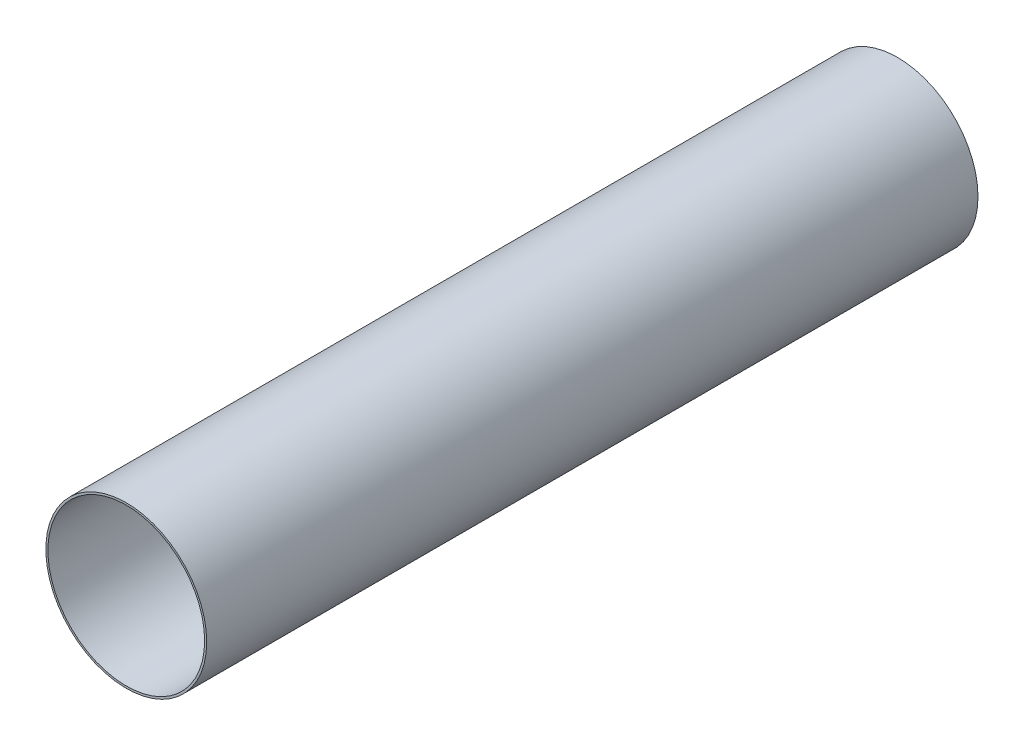
ISO-10303-21;
HEADER;
FILE_DESCRIPTION(('STEP AP214'),'2;1');
FILE_NAME('part.step','',(''),(''),'','','');
FILE_SCHEMA(('AUTOMOTIVE_DESIGN { 1 0 10303 214 1 1 1 1 }'));
ENDSEC;
DATA;
#1=APPLICATION_CONTEXT('core data for automotive mechanical design processes');
#2=APPLICATION_PROTOCOL_DEFINITION('international standard','automotive_design',2000,#1);
#3=PRODUCT_CONTEXT('',#1,'mechanical');
#4=PRODUCT('Part','Part','',(#3));
#5=PRODUCT_RELATED_PRODUCT_CATEGORY('part','',(#4));
#6=PRODUCT_DEFINITION_FORMATION('','',#4);
#7=PRODUCT_DEFINITION_CONTEXT('part definition',#1,'design');
#8=PRODUCT_DEFINITION('design','',#6,#7);
#9=PRODUCT_DEFINITION_SHAPE('','',#8);
#10=(LENGTH_UNIT() NAMED_UNIT(*) SI_UNIT(.MILLI.,.METRE.));
#11=(NAMED_UNIT(*) PLANE_ANGLE_UNIT() SI_UNIT($,.RADIAN.));
#12=(NAMED_UNIT(*) SI_UNIT($,.STERADIAN.) SOLID_ANGLE_UNIT());
#13=UNCERTAINTY_MEASURE_WITH_UNIT(LENGTH_MEASURE(1.E-05),#10,'distance_accuracy_value','');
#14=(GEOMETRIC_REPRESENTATION_CONTEXT(3) GLOBAL_UNCERTAINTY_ASSIGNED_CONTEXT((#13)) GLOBAL_UNIT_ASSIGNED_CONTEXT((#10,
#11,#12)) REPRESENTATION_CONTEXT('',''));
#15=CARTESIAN_POINT('',(0.,0.,0.));
#16=DIRECTION('',(0.,0.,1.));
#17=DIRECTION('',(1.,0.,0.));
#18=AXIS2_PLACEMENT_3D('',#15,#16,#17);
#19=CARTESIAN_POINT('',(0.,0.,750.));
#20=DIRECTION('',(0.,0.,1.));
#21=DIRECTION('',(1.,0.,0.));
#22=AXIS2_PLACEMENT_3D('',#19,#20,#21);
#23=PLANE('',#22);
#24=CARTESIAN_POINT('',(0.,0.,750.));
#25=DIRECTION('',(0.,0.,1.));
#26=DIRECTION('',(1.,0.,0.));
#27=AXIS2_PLACEMENT_3D('',#24,#25,#26);
#28=CIRCLE('',#27,78.2);
#29=CARTESIAN_POINT('',(78.2,0.,750.));
#30=VERTEX_POINT('',#29);
#31=EDGE_CURVE('E10',#30,#30,#28,.T.);
#32=ORIENTED_EDGE('',*,*,#31,.T.);
#33=EDGE_LOOP('',(#32));
#34=FACE_BOUND('',#33,.T.);
#35=CARTESIAN_POINT('',(0.,0.,750.));
#36=DIRECTION('',(0.,0.,1.));
#37=DIRECTION('',(1.,0.,0.));
#38=AXIS2_PLACEMENT_3D('',#35,#36,#37);
#39=CIRCLE('',#38,76.2);
#40=CARTESIAN_POINT('',(76.2,0.,750.));
#41=VERTEX_POINT('',#40);
#42=EDGE_CURVE('E44',#41,#41,#39,.T.);
#43=ORIENTED_EDGE('',*,*,#42,.F.);
#44=EDGE_LOOP('',(#43));
#45=FACE_BOUND('',#44,.T.);
#46=ADVANCED_FACE('F33',(#34,#45),#23,.T.);
#47=CARTESIAN_POINT('',(0.,0.,0.));
#48=DIRECTION('',(0.,0.,1.));
#49=DIRECTION('',(1.,0.,0.));
#50=AXIS2_PLACEMENT_3D('',#47,#48,#49);
#51=PLANE('',#50);
#52=CARTESIAN_POINT('',(0.,0.,0.));
#53=DIRECTION('',(0.,0.,1.));
#54=DIRECTION('',(1.,0.,0.));
#55=AXIS2_PLACEMENT_3D('',#52,#53,#54);
#56=CIRCLE('',#55,78.2);
#57=CARTESIAN_POINT('',(78.2,0.,0.));
#58=VERTEX_POINT('',#57);
#59=EDGE_CURVE('E37',#58,#58,#56,.T.);
#60=ORIENTED_EDGE('',*,*,#59,.F.);
#61=EDGE_LOOP('',(#60));
#62=FACE_BOUND('',#61,.T.);
#63=CARTESIAN_POINT('',(0.,0.,0.));
#64=DIRECTION('',(0.,0.,1.));
#65=DIRECTION('',(1.,0.,0.));
#66=AXIS2_PLACEMENT_3D('',#63,#64,#65);
#67=CIRCLE('',#66,76.2);
#68=CARTESIAN_POINT('',(76.2,0.,0.));
#69=VERTEX_POINT('',#68);
#70=EDGE_CURVE('E46',#69,#69,#67,.T.);
#71=ORIENTED_EDGE('',*,*,#70,.T.);
#72=EDGE_LOOP('',(#71));
#73=FACE_BOUND('',#72,.T.);
#74=ADVANCED_FACE('F56',(#62,#73),#51,.F.);
#75=CARTESIAN_POINT('',(0.,0.,750.));
#76=DIRECTION('',(0.,0.,-1.));
#77=DIRECTION('',(-1.,0.,0.));
#78=AXIS2_PLACEMENT_3D('',#75,#76,#77);
#79=CYLINDRICAL_SURFACE('',#78,78.2);
#80=ORIENTED_EDGE('',*,*,#31,.F.);
#81=EDGE_LOOP('',(#80));
#82=FACE_BOUND('',#81,.T.);
#83=ORIENTED_EDGE('',*,*,#59,.T.);
#84=EDGE_LOOP('',(#83));
#85=FACE_BOUND('',#84,.T.);
#86=ADVANCED_FACE('F35',(#82,#85),#79,.T.);
#87=CARTESIAN_POINT('',(0.,0.,750.));
#88=DIRECTION('',(0.,0.,-1.));
#89=DIRECTION('',(-1.,0.,0.));
#90=AXIS2_PLACEMENT_3D('',#87,#88,#89);
#91=CYLINDRICAL_SURFACE('',#90,76.2);
#92=ORIENTED_EDGE('',*,*,#42,.T.);
#93=EDGE_LOOP('',(#92));
#94=FACE_BOUND('',#93,.T.);
#95=ORIENTED_EDGE('',*,*,#70,.F.);
#96=EDGE_LOOP('',(#95));
#97=FACE_BOUND('',#96,.T.);
#98=ADVANCED_FACE('F52',(#94,#97),#91,.F.);
#99=CLOSED_SHELL('',(#46,#74,#86,#98));
#100=MANIFOLD_SOLID_BREP('B2',#99);
#101=ADVANCED_BREP_SHAPE_REPRESENTATION('',(#18,#100),#14);
#102=SHAPE_DEFINITION_REPRESENTATION(#9,#101);
ENDSEC;
END-ISO-10303-21;
